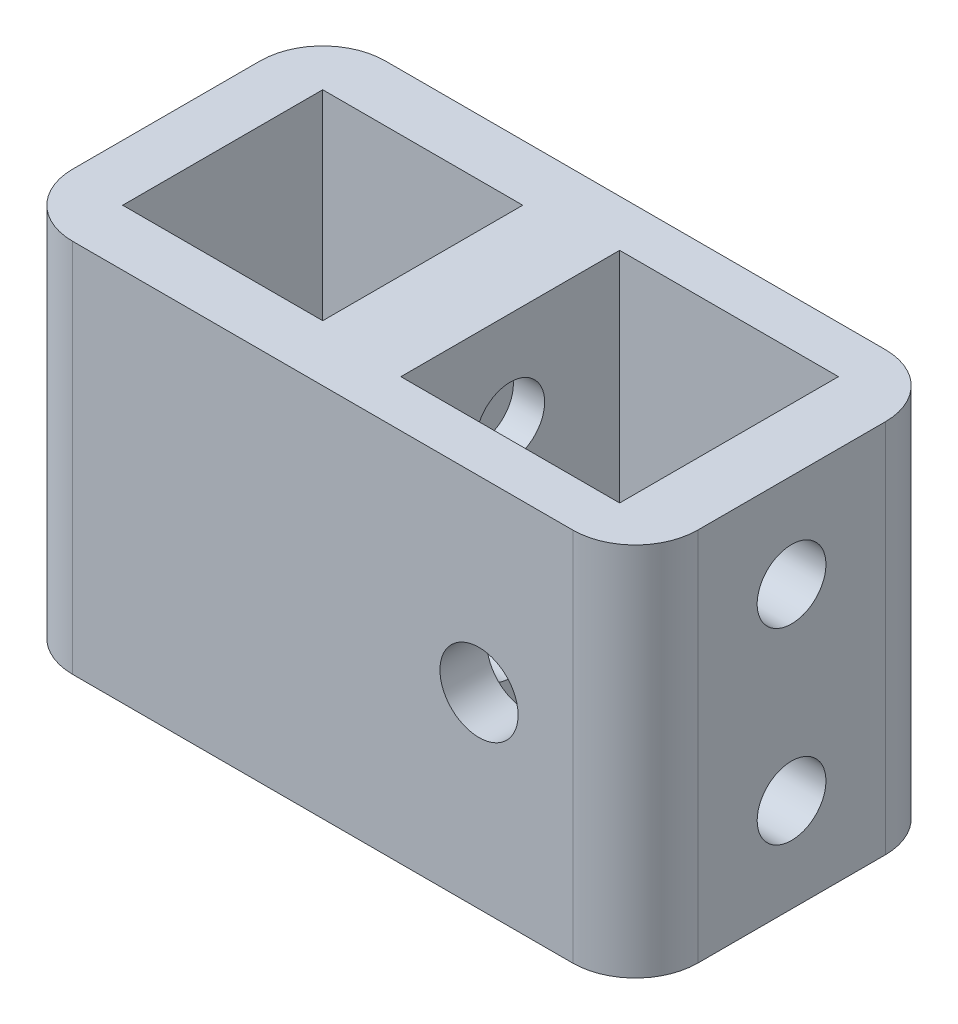
ISO-10303-21;
HEADER;
FILE_DESCRIPTION(('STEP AP214'),'2;1');
FILE_NAME('part.step','',(''),(''),'','','');
FILE_SCHEMA(('AUTOMOTIVE_DESIGN { 1 0 10303 214 1 1 1 1 }'));
ENDSEC;
DATA;
#1=APPLICATION_CONTEXT('core data for automotive mechanical design processes');
#2=APPLICATION_PROTOCOL_DEFINITION('international standard','automotive_design',2000,#1);
#3=PRODUCT_CONTEXT('',#1,'mechanical');
#4=PRODUCT('Part','Part','',(#3));
#5=PRODUCT_RELATED_PRODUCT_CATEGORY('part','',(#4));
#6=PRODUCT_DEFINITION_FORMATION('','',#4);
#7=PRODUCT_DEFINITION_CONTEXT('part definition',#1,'design');
#8=PRODUCT_DEFINITION('design','',#6,#7);
#9=PRODUCT_DEFINITION_SHAPE('','',#8);
#10=(LENGTH_UNIT() NAMED_UNIT(*) SI_UNIT(.MILLI.,.METRE.));
#11=(NAMED_UNIT(*) PLANE_ANGLE_UNIT() SI_UNIT($,.RADIAN.));
#12=(NAMED_UNIT(*) SI_UNIT($,.STERADIAN.) SOLID_ANGLE_UNIT());
#13=UNCERTAINTY_MEASURE_WITH_UNIT(LENGTH_MEASURE(1.E-05),#10,'distance_accuracy_value','');
#14=(GEOMETRIC_REPRESENTATION_CONTEXT(3) GLOBAL_UNCERTAINTY_ASSIGNED_CONTEXT((#13)) GLOBAL_UNIT_ASSIGNED_CONTEXT((#10,
#11,#12)) REPRESENTATION_CONTEXT('',''));
#15=CARTESIAN_POINT('',(0.,0.,0.));
#16=DIRECTION('',(0.,0.,1.));
#17=DIRECTION('',(1.,0.,0.));
#18=AXIS2_PLACEMENT_3D('',#15,#16,#17);
#19=CARTESIAN_POINT('',(10.,6.,-7.));
#20=DIRECTION('',(0.,0.,1.));
#21=DIRECTION('',(1.,0.,0.));
#22=AXIS2_PLACEMENT_3D('',#19,#20,#21);
#23=CYLINDRICAL_SURFACE('',#22,1.25);
#24=CARTESIAN_POINT('',(10.,6.,-5.));
#25=DIRECTION('',(0.,0.,1.));
#26=DIRECTION('',(1.,0.,0.));
#27=AXIS2_PLACEMENT_3D('',#24,#25,#26);
#28=CIRCLE('',#27,1.25);
#29=CARTESIAN_POINT('',(11.25,6.,-5.));
#30=VERTEX_POINT('',#29);
#31=EDGE_CURVE('E210',#30,#30,#28,.T.);
#32=ORIENTED_EDGE('',*,*,#31,.F.);
#33=EDGE_LOOP('',(#32));
#34=FACE_BOUND('',#33,.T.);
#35=CARTESIAN_POINT('',(10.,6.,-3.5));
#36=DIRECTION('',(0.,0.,1.));
#37=DIRECTION('',(1.,0.,0.));
#38=AXIS2_PLACEMENT_3D('',#35,#36,#37);
#39=CIRCLE('',#38,1.25);
#40=CARTESIAN_POINT('',(11.25,6.,-3.5));
#41=VERTEX_POINT('',#40);
#42=EDGE_CURVE('E190',#41,#41,#39,.F.);
#43=ORIENTED_EDGE('',*,*,#42,.F.);
#44=EDGE_LOOP('',(#43));
#45=FACE_BOUND('',#44,.T.);
#46=ADVANCED_FACE('F36',(#34,#45),#23,.F.);
#47=CARTESIAN_POINT('',(0.,4.,0.));
#48=DIRECTION('',(0.,1.,0.));
#49=DIRECTION('',(0.,0.,1.));
#50=AXIS2_PLACEMENT_3D('',#47,#48,#49);
#51=PLANE('',#50);
#52=CARTESIAN_POINT('',(0.,4.,0.));
#53=DIRECTION('',(0.,1.,0.));
#54=DIRECTION('',(0.,0.,1.));
#55=AXIS2_PLACEMENT_3D('',#52,#53,#54);
#56=CIRCLE('',#55,2.);
#57=CARTESIAN_POINT('',(0.,4.,2.));
#58=VERTEX_POINT('',#57);
#59=EDGE_CURVE('E260',#58,#58,#56,.T.);
#60=ORIENTED_EDGE('',*,*,#59,.F.);
#61=EDGE_LOOP('',(#60));
#62=FACE_BOUND('',#61,.T.);
#63=DIRECTION('',(0.,0.,1.));
#64=VECTOR('',#63,1.);
#65=CARTESIAN_POINT('',(-3.2,4.,0.));
#66=LINE('',#65,#64);
#67=CARTESIAN_POINT('',(-3.2,4.,-3.2));
#68=VERTEX_POINT('',#67);
#69=CARTESIAN_POINT('',(-3.2,4.,3.2));
#70=VERTEX_POINT('',#69);
#71=EDGE_CURVE('E255',#68,#70,#66,.T.);
#72=ORIENTED_EDGE('',*,*,#71,.T.);
#73=DIRECTION('',(1.,0.,0.));
#74=VECTOR('',#73,1.);
#75=CARTESIAN_POINT('',(0.,4.,3.2));
#76=LINE('',#75,#74);
#77=CARTESIAN_POINT('',(3.2,4.,3.2));
#78=VERTEX_POINT('',#77);
#79=EDGE_CURVE('E257',#70,#78,#76,.T.);
#80=ORIENTED_EDGE('',*,*,#79,.T.);
#81=DIRECTION('',(0.,0.,1.));
#82=VECTOR('',#81,1.);
#83=CARTESIAN_POINT('',(3.2,4.,0.));
#84=LINE('',#83,#82);
#85=CARTESIAN_POINT('',(3.2,4.,-3.2));
#86=VERTEX_POINT('',#85);
#87=EDGE_CURVE('E249',#86,#78,#84,.T.);
#88=ORIENTED_EDGE('',*,*,#87,.F.);
#89=DIRECTION('',(1.,0.,0.));
#90=VECTOR('',#89,1.);
#91=CARTESIAN_POINT('',(0.,4.,-3.2));
#92=LINE('',#91,#90);
#93=EDGE_CURVE('E252',#68,#86,#92,.T.);
#94=ORIENTED_EDGE('',*,*,#93,.F.);
#95=EDGE_LOOP('',(#72,#80,#88,#94));
#96=FACE_BOUND('',#95,.T.);
#97=ADVANCED_FACE('F317',(#62,#96),#51,.T.);
#98=CARTESIAN_POINT('',(-5.,4.,0.));
#99=DIRECTION('',(-1.,0.,0.));
#100=DIRECTION('',(0.,0.,1.));
#101=AXIS2_PLACEMENT_3D('',#98,#99,#100);
#102=PLANE('',#101);
#103=DIRECTION('',(0.,0.,-1.));
#104=VECTOR('',#103,1.);
#105=CARTESIAN_POINT('',(-5.,0.,0.));
#106=LINE('',#105,#104);
#107=CARTESIAN_POINT('',(-5.,0.,3.));
#108=VERTEX_POINT('',#107);
#109=CARTESIAN_POINT('',(-5.,0.,-3.));
#110=VERTEX_POINT('',#109);
#111=EDGE_CURVE('E267',#108,#110,#106,.T.);
#112=ORIENTED_EDGE('',*,*,#111,.F.);
#113=DIRECTION('',(0.,-1.,0.));
#114=VECTOR('',#113,1.);
#115=CARTESIAN_POINT('',(-5.,4.,3.));
#116=LINE('',#115,#114);
#117=CARTESIAN_POINT('',(-5.,12.,3.));
#118=VERTEX_POINT('',#117);
#119=EDGE_CURVE('E292',#108,#118,#116,.F.);
#120=ORIENTED_EDGE('',*,*,#119,.T.);
#121=DIRECTION('',(0.,0.,-1.));
#122=VECTOR('',#121,1.);
#123=CARTESIAN_POINT('',(-5.,12.,0.));
#124=LINE('',#123,#122);
#125=CARTESIAN_POINT('',(-5.,12.,-3.));
#126=VERTEX_POINT('',#125);
#127=EDGE_CURVE('E214',#118,#126,#124,.T.);
#128=ORIENTED_EDGE('',*,*,#127,.T.);
#129=DIRECTION('',(0.,-1.,0.));
#130=VECTOR('',#129,1.);
#131=CARTESIAN_POINT('',(-5.,0.,-3.));
#132=LINE('',#131,#130);
#133=EDGE_CURVE('E289',#126,#110,#132,.T.);
#134=ORIENTED_EDGE('',*,*,#133,.T.);
#135=EDGE_LOOP('',(#112,#120,#128,#134));
#136=FACE_BOUND('',#135,.T.);
#137=ADVANCED_FACE('F324',(#136),#102,.T.);
#138=CARTESIAN_POINT('',(0.,4.,5.));
#139=DIRECTION('',(0.,0.,1.));
#140=DIRECTION('',(1.,0.,0.));
#141=AXIS2_PLACEMENT_3D('',#138,#139,#140);
#142=PLANE('',#141);
#143=CARTESIAN_POINT('',(10.,6.,5.));
#144=DIRECTION('',(0.,0.,1.));
#145=DIRECTION('',(1.,0.,0.));
#146=AXIS2_PLACEMENT_3D('',#143,#144,#145);
#147=CIRCLE('',#146,1.25);
#148=CARTESIAN_POINT('',(11.25,6.,5.));
#149=VERTEX_POINT('',#148);
#150=EDGE_CURVE('E199',#149,#149,#147,.T.);
#151=ORIENTED_EDGE('',*,*,#150,.F.);
#152=EDGE_LOOP('',(#151));
#153=FACE_BOUND('',#152,.T.);
#154=DIRECTION('',(-1.,0.,0.));
#155=VECTOR('',#154,1.);
#156=CARTESIAN_POINT('',(0.,12.,5.));
#157=LINE('',#156,#155);
#158=CARTESIAN_POINT('',(13.,12.,5.));
#159=VERTEX_POINT('',#158);
#160=CARTESIAN_POINT('',(-3.,12.,5.));
#161=VERTEX_POINT('',#160);
#162=EDGE_CURVE('E220',#159,#161,#157,.T.);
#163=ORIENTED_EDGE('',*,*,#162,.T.);
#164=DIRECTION('',(0.,-1.,0.));
#165=VECTOR('',#164,1.);
#166=CARTESIAN_POINT('',(-3.,4.,5.));
#167=LINE('',#166,#165);
#168=CARTESIAN_POINT('',(-3.,0.,5.));
#169=VERTEX_POINT('',#168);
#170=EDGE_CURVE('E278',#161,#169,#167,.T.);
#171=ORIENTED_EDGE('',*,*,#170,.T.);
#172=DIRECTION('',(-1.,0.,0.));
#173=VECTOR('',#172,1.);
#174=CARTESIAN_POINT('',(0.,0.,5.));
#175=LINE('',#174,#173);
#176=CARTESIAN_POINT('',(13.,0.,5.));
#177=VERTEX_POINT('',#176);
#178=EDGE_CURVE('E270',#177,#169,#175,.T.);
#179=ORIENTED_EDGE('',*,*,#178,.F.);
#180=DIRECTION('',(0.,-1.,0.));
#181=VECTOR('',#180,1.);
#182=CARTESIAN_POINT('',(13.,4.,5.));
#183=LINE('',#182,#181);
#184=EDGE_CURVE('E263',#177,#159,#183,.F.);
#185=ORIENTED_EDGE('',*,*,#184,.T.);
#186=EDGE_LOOP('',(#163,#171,#179,#185));
#187=FACE_BOUND('',#186,.T.);
#188=ADVANCED_FACE('F347',(#153,#187),#142,.T.);
#189=CARTESIAN_POINT('',(0.,4.,0.));
#190=DIRECTION('',(0.,-1.,0.));
#191=DIRECTION('',(0.,0.,-1.));
#192=AXIS2_PLACEMENT_3D('',#189,#190,#191);
#193=CYLINDRICAL_SURFACE('',#192,2.);
#194=ORIENTED_EDGE('',*,*,#59,.T.);
#195=EDGE_LOOP('',(#194));
#196=FACE_BOUND('',#195,.T.);
#197=CARTESIAN_POINT('',(0.,0.,0.));
#198=DIRECTION('',(0.,1.,0.));
#199=DIRECTION('',(0.,0.,1.));
#200=AXIS2_PLACEMENT_3D('',#197,#198,#199);
#201=CIRCLE('',#200,2.);
#202=CARTESIAN_POINT('',(0.,0.,2.));
#203=VERTEX_POINT('',#202);
#204=EDGE_CURVE('E259',#203,#203,#201,.T.);
#205=ORIENTED_EDGE('',*,*,#204,.F.);
#206=EDGE_LOOP('',(#205));
#207=FACE_BOUND('',#206,.T.);
#208=ADVANCED_FACE('F350',(#196,#207),#193,.F.);
#209=CARTESIAN_POINT('',(0.,4.,-5.));
#210=DIRECTION('',(0.,0.,1.));
#211=DIRECTION('',(1.,0.,0.));
#212=AXIS2_PLACEMENT_3D('',#209,#210,#211);
#213=PLANE('',#212);
#214=ORIENTED_EDGE('',*,*,#31,.T.);
#215=EDGE_LOOP('',(#214));
#216=FACE_BOUND('',#215,.T.);
#217=DIRECTION('',(-1.,0.,0.));
#218=VECTOR('',#217,1.);
#219=CARTESIAN_POINT('',(0.,0.,-5.));
#220=LINE('',#219,#218);
#221=CARTESIAN_POINT('',(13.,0.,-5.));
#222=VERTEX_POINT('',#221);
#223=CARTESIAN_POINT('',(-3.,0.,-5.));
#224=VERTEX_POINT('',#223);
#225=EDGE_CURVE('E264',#222,#224,#220,.T.);
#226=ORIENTED_EDGE('',*,*,#225,.T.);
#227=DIRECTION('',(0.,-1.,0.));
#228=VECTOR('',#227,1.);
#229=CARTESIAN_POINT('',(-3.,12.,-5.));
#230=LINE('',#229,#228);
#231=CARTESIAN_POINT('',(-3.,12.,-5.));
#232=VERTEX_POINT('',#231);
#233=EDGE_CURVE('E305',#224,#232,#230,.F.);
#234=ORIENTED_EDGE('',*,*,#233,.T.);
#235=DIRECTION('',(-1.,0.,0.));
#236=VECTOR('',#235,1.);
#237=CARTESIAN_POINT('',(0.,12.,-5.));
#238=LINE('',#237,#236);
#239=CARTESIAN_POINT('',(13.,12.,-5.));
#240=VERTEX_POINT('',#239);
#241=EDGE_CURVE('E223',#240,#232,#238,.T.);
#242=ORIENTED_EDGE('',*,*,#241,.F.);
#243=DIRECTION('',(0.,-1.,0.));
#244=VECTOR('',#243,1.);
#245=CARTESIAN_POINT('',(13.,0.,-5.));
#246=LINE('',#245,#244);
#247=EDGE_CURVE('E302',#240,#222,#246,.T.);
#248=ORIENTED_EDGE('',*,*,#247,.T.);
#249=EDGE_LOOP('',(#226,#234,#242,#248));
#250=FACE_BOUND('',#249,.T.);
#251=ADVANCED_FACE('F374',(#216,#250),#213,.F.);
#252=CARTESIAN_POINT('',(0.,0.,0.));
#253=DIRECTION('',(0.,1.,0.));
#254=DIRECTION('',(0.,0.,1.));
#255=AXIS2_PLACEMENT_3D('',#252,#253,#254);
#256=PLANE('',#255);
#257=DIRECTION('',(0.,0.,-1.));
#258=VECTOR('',#257,1.);
#259=CARTESIAN_POINT('',(6.,0.,0.));
#260=LINE('',#259,#258);
#261=CARTESIAN_POINT('',(6.,0.,3.5));
#262=VERTEX_POINT('',#261);
#263=CARTESIAN_POINT('',(6.,0.,-3.5));
#264=VERTEX_POINT('',#263);
#265=EDGE_CURVE('E188',#262,#264,#260,.T.);
#266=ORIENTED_EDGE('',*,*,#265,.F.);
#267=DIRECTION('',(1.,0.,0.));
#268=VECTOR('',#267,1.);
#269=CARTESIAN_POINT('',(0.,0.,3.5));
#270=LINE('',#269,#268);
#271=CARTESIAN_POINT('',(13.,0.,3.5));
#272=VERTEX_POINT('',#271);
#273=EDGE_CURVE('E192',#262,#272,#270,.T.);
#274=ORIENTED_EDGE('',*,*,#273,.T.);
#275=DIRECTION('',(0.,0.,-1.));
#276=VECTOR('',#275,1.);
#277=CARTESIAN_POINT('',(13.,0.,0.));
#278=LINE('',#277,#276);
#279=CARTESIAN_POINT('',(13.,0.,-3.5));
#280=VERTEX_POINT('',#279);
#281=EDGE_CURVE('E182',#272,#280,#278,.T.);
#282=ORIENTED_EDGE('',*,*,#281,.T.);
#283=DIRECTION('',(1.,0.,0.));
#284=VECTOR('',#283,1.);
#285=CARTESIAN_POINT('',(0.,0.,-3.5));
#286=LINE('',#285,#284);
#287=EDGE_CURVE('E156',#264,#280,#286,.T.);
#288=ORIENTED_EDGE('',*,*,#287,.F.);
#289=EDGE_LOOP('',(#266,#274,#282,#288));
#290=FACE_BOUND('',#289,.T.);
#291=ORIENTED_EDGE('',*,*,#178,.T.);
#292=CARTESIAN_POINT('',(-3.,0.,3.));
#293=DIRECTION('',(0.,1.,0.));
#294=DIRECTION('',(0.,0.,1.));
#295=AXIS2_PLACEMENT_3D('',#292,#293,#294);
#296=CIRCLE('',#295,2.);
#297=EDGE_CURVE('E287',#169,#108,#296,.F.);
#298=ORIENTED_EDGE('',*,*,#297,.T.);
#299=ORIENTED_EDGE('',*,*,#111,.T.);
#300=CARTESIAN_POINT('',(-3.,0.,-3.));
#301=DIRECTION('',(0.,1.,0.));
#302=DIRECTION('',(0.,0.,1.));
#303=AXIS2_PLACEMENT_3D('',#300,#301,#302);
#304=CIRCLE('',#303,2.);
#305=EDGE_CURVE('E285',#110,#224,#304,.F.);
#306=ORIENTED_EDGE('',*,*,#305,.T.);
#307=ORIENTED_EDGE('',*,*,#225,.F.);
#308=CARTESIAN_POINT('',(13.,0.,-3.));
#309=DIRECTION('',(0.,1.,0.));
#310=DIRECTION('',(0.,0.,1.));
#311=AXIS2_PLACEMENT_3D('',#308,#309,#310);
#312=CIRCLE('',#311,2.);
#313=CARTESIAN_POINT('',(15.,0.,-3.));
#314=VERTEX_POINT('',#313);
#315=EDGE_CURVE('E283',#222,#314,#312,.F.);
#316=ORIENTED_EDGE('',*,*,#315,.T.);
#317=DIRECTION('',(0.,0.,1.));
#318=VECTOR('',#317,1.);
#319=CARTESIAN_POINT('',(15.,0.,0.));
#320=LINE('',#319,#318);
#321=CARTESIAN_POINT('',(15.,0.,3.));
#322=VERTEX_POINT('',#321);
#323=EDGE_CURVE('E215',#314,#322,#320,.T.);
#324=ORIENTED_EDGE('',*,*,#323,.T.);
#325=CARTESIAN_POINT('',(13.,0.,3.));
#326=DIRECTION('',(0.,1.,0.));
#327=DIRECTION('',(0.,0.,1.));
#328=AXIS2_PLACEMENT_3D('',#325,#326,#327);
#329=CIRCLE('',#328,2.);
#330=EDGE_CURVE('E281',#322,#177,#329,.F.);
#331=ORIENTED_EDGE('',*,*,#330,.T.);
#332=EDGE_LOOP('',(#291,#298,#299,#306,#307,#316,#324,#331));
#333=FACE_BOUND('',#332,.T.);
#334=ORIENTED_EDGE('',*,*,#204,.T.);
#335=EDGE_LOOP('',(#334));
#336=FACE_BOUND('',#335,.T.);
#337=ADVANCED_FACE('F363',(#290,#333,#336),#256,.F.);
#338=CARTESIAN_POINT('',(0.,12.,3.2));
#339=DIRECTION('',(0.,0.,1.));
#340=DIRECTION('',(1.,0.,0.));
#341=AXIS2_PLACEMENT_3D('',#338,#339,#340);
#342=PLANE('',#341);
#343=ORIENTED_EDGE('',*,*,#79,.F.);
#344=DIRECTION('',(0.,-1.,0.));
#345=VECTOR('',#344,1.);
#346=CARTESIAN_POINT('',(-3.2,12.,3.2));
#347=LINE('',#346,#345);
#348=CARTESIAN_POINT('',(-3.2,12.,3.2));
#349=VERTEX_POINT('',#348);
#350=EDGE_CURVE('E246',#349,#70,#347,.T.);
#351=ORIENTED_EDGE('',*,*,#350,.F.);
#352=DIRECTION('',(-1.,0.,0.));
#353=VECTOR('',#352,1.);
#354=CARTESIAN_POINT('',(0.,12.,3.2));
#355=LINE('',#354,#353);
#356=CARTESIAN_POINT('',(3.2,12.,3.2));
#357=VERTEX_POINT('',#356);
#358=EDGE_CURVE('E226',#357,#349,#355,.T.);
#359=ORIENTED_EDGE('',*,*,#358,.F.);
#360=DIRECTION('',(0.,-1.,0.));
#361=VECTOR('',#360,1.);
#362=CARTESIAN_POINT('',(3.2,12.,3.2));
#363=LINE('',#362,#361);
#364=EDGE_CURVE('E237',#357,#78,#363,.T.);
#365=ORIENTED_EDGE('',*,*,#364,.T.);
#366=EDGE_LOOP('',(#343,#351,#359,#365));
#367=FACE_BOUND('',#366,.T.);
#368=ADVANCED_FACE('F397',(#367),#342,.F.);
#369=CARTESIAN_POINT('',(-3.2,12.,0.));
#370=DIRECTION('',(-1.,0.,0.));
#371=DIRECTION('',(0.,0.,1.));
#372=AXIS2_PLACEMENT_3D('',#369,#370,#371);
#373=PLANE('',#372);
#374=ORIENTED_EDGE('',*,*,#71,.F.);
#375=DIRECTION('',(0.,-1.,0.));
#376=VECTOR('',#375,1.);
#377=CARTESIAN_POINT('',(-3.2,12.,-3.2));
#378=LINE('',#377,#376);
#379=CARTESIAN_POINT('',(-3.2,12.,-3.2));
#380=VERTEX_POINT('',#379);
#381=EDGE_CURVE('E243',#380,#68,#378,.T.);
#382=ORIENTED_EDGE('',*,*,#381,.F.);
#383=DIRECTION('',(0.,0.,-1.));
#384=VECTOR('',#383,1.);
#385=CARTESIAN_POINT('',(-3.2,12.,0.));
#386=LINE('',#385,#384);
#387=EDGE_CURVE('E229',#349,#380,#386,.T.);
#388=ORIENTED_EDGE('',*,*,#387,.F.);
#389=ORIENTED_EDGE('',*,*,#350,.T.);
#390=EDGE_LOOP('',(#374,#382,#388,#389));
#391=FACE_BOUND('',#390,.T.);
#392=ADVANCED_FACE('F400',(#391),#373,.F.);
#393=CARTESIAN_POINT('',(0.,12.,-3.2));
#394=DIRECTION('',(0.,0.,1.));
#395=DIRECTION('',(1.,0.,0.));
#396=AXIS2_PLACEMENT_3D('',#393,#394,#395);
#397=PLANE('',#396);
#398=ORIENTED_EDGE('',*,*,#381,.T.);
#399=ORIENTED_EDGE('',*,*,#93,.T.);
#400=DIRECTION('',(0.,-1.,0.));
#401=VECTOR('',#400,1.);
#402=CARTESIAN_POINT('',(3.2,12.,-3.2));
#403=LINE('',#402,#401);
#404=CARTESIAN_POINT('',(3.2,12.,-3.2));
#405=VERTEX_POINT('',#404);
#406=EDGE_CURVE('E240',#405,#86,#403,.T.);
#407=ORIENTED_EDGE('',*,*,#406,.F.);
#408=DIRECTION('',(-1.,0.,0.));
#409=VECTOR('',#408,1.);
#410=CARTESIAN_POINT('',(0.,12.,-3.2));
#411=LINE('',#410,#409);
#412=EDGE_CURVE('E231',#405,#380,#411,.T.);
#413=ORIENTED_EDGE('',*,*,#412,.T.);
#414=EDGE_LOOP('',(#398,#399,#407,#413));
#415=FACE_BOUND('',#414,.T.);
#416=ADVANCED_FACE('F402',(#415),#397,.T.);
#417=CARTESIAN_POINT('',(3.2,12.,0.));
#418=DIRECTION('',(-1.,0.,0.));
#419=DIRECTION('',(0.,0.,1.));
#420=AXIS2_PLACEMENT_3D('',#417,#418,#419);
#421=PLANE('',#420);
#422=ORIENTED_EDGE('',*,*,#406,.T.);
#423=ORIENTED_EDGE('',*,*,#87,.T.);
#424=ORIENTED_EDGE('',*,*,#364,.F.);
#425=DIRECTION('',(0.,0.,-1.));
#426=VECTOR('',#425,1.);
#427=CARTESIAN_POINT('',(3.2,12.,0.));
#428=LINE('',#427,#426);
#429=EDGE_CURVE('E234',#357,#405,#428,.T.);
#430=ORIENTED_EDGE('',*,*,#429,.T.);
#431=EDGE_LOOP('',(#422,#423,#424,#430));
#432=FACE_BOUND('',#431,.T.);
#433=ADVANCED_FACE('F388',(#432),#421,.T.);
#434=CARTESIAN_POINT('',(0.,12.,0.));
#435=DIRECTION('',(0.,1.,0.));
#436=DIRECTION('',(0.,0.,1.));
#437=AXIS2_PLACEMENT_3D('',#434,#435,#436);
#438=PLANE('',#437);
#439=DIRECTION('',(1.,0.,0.));
#440=VECTOR('',#439,1.);
#441=CARTESIAN_POINT('',(0.,12.,3.5));
#442=LINE('',#441,#440);
#443=CARTESIAN_POINT('',(6.,12.,3.5));
#444=VERTEX_POINT('',#443);
#445=CARTESIAN_POINT('',(13.,12.,3.5));
#446=VERTEX_POINT('',#445);
#447=EDGE_CURVE('E61',#444,#446,#442,.T.);
#448=ORIENTED_EDGE('',*,*,#447,.F.);
#449=DIRECTION('',(0.,0.,-1.));
#450=VECTOR('',#449,1.);
#451=CARTESIAN_POINT('',(6.,12.,0.));
#452=LINE('',#451,#450);
#453=CARTESIAN_POINT('',(6.,12.,-3.5));
#454=VERTEX_POINT('',#453);
#455=EDGE_CURVE('E169',#444,#454,#452,.T.);
#456=ORIENTED_EDGE('',*,*,#455,.T.);
#457=DIRECTION('',(1.,0.,0.));
#458=VECTOR('',#457,1.);
#459=CARTESIAN_POINT('',(0.,12.,-3.5));
#460=LINE('',#459,#458);
#461=CARTESIAN_POINT('',(13.,12.,-3.5));
#462=VERTEX_POINT('',#461);
#463=EDGE_CURVE('E153',#454,#462,#460,.T.);
#464=ORIENTED_EDGE('',*,*,#463,.T.);
#465=DIRECTION('',(0.,0.,-1.));
#466=VECTOR('',#465,1.);
#467=CARTESIAN_POINT('',(13.,12.,0.));
#468=LINE('',#467,#466);
#469=EDGE_CURVE('E162',#446,#462,#468,.T.);
#470=ORIENTED_EDGE('',*,*,#469,.F.);
#471=EDGE_LOOP('',(#448,#456,#464,#470));
#472=FACE_BOUND('',#471,.T.);
#473=ORIENTED_EDGE('',*,*,#127,.F.);
#474=CARTESIAN_POINT('',(-3.,12.,3.));
#475=DIRECTION('',(0.,1.,0.));
#476=DIRECTION('',(0.,0.,1.));
#477=AXIS2_PLACEMENT_3D('',#474,#475,#476);
#478=CIRCLE('',#477,2.);
#479=EDGE_CURVE('E300',#118,#161,#478,.T.);
#480=ORIENTED_EDGE('',*,*,#479,.T.);
#481=ORIENTED_EDGE('',*,*,#162,.F.);
#482=CARTESIAN_POINT('',(13.,12.,3.));
#483=DIRECTION('',(0.,1.,0.));
#484=DIRECTION('',(0.,0.,1.));
#485=AXIS2_PLACEMENT_3D('',#482,#483,#484);
#486=CIRCLE('',#485,2.);
#487=CARTESIAN_POINT('',(15.,12.,3.));
#488=VERTEX_POINT('',#487);
#489=EDGE_CURVE('E294',#159,#488,#486,.T.);
#490=ORIENTED_EDGE('',*,*,#489,.T.);
#491=DIRECTION('',(0.,0.,1.));
#492=VECTOR('',#491,1.);
#493=CARTESIAN_POINT('',(15.,12.,0.));
#494=LINE('',#493,#492);
#495=CARTESIAN_POINT('',(15.,12.,-3.));
#496=VERTEX_POINT('',#495);
#497=EDGE_CURVE('E211',#496,#488,#494,.T.);
#498=ORIENTED_EDGE('',*,*,#497,.F.);
#499=CARTESIAN_POINT('',(13.,12.,-3.));
#500=DIRECTION('',(0.,1.,0.));
#501=DIRECTION('',(0.,0.,1.));
#502=AXIS2_PLACEMENT_3D('',#499,#500,#501);
#503=CIRCLE('',#502,2.);
#504=EDGE_CURVE('E296',#496,#240,#503,.T.);
#505=ORIENTED_EDGE('',*,*,#504,.T.);
#506=ORIENTED_EDGE('',*,*,#241,.T.);
#507=CARTESIAN_POINT('',(-3.,12.,-3.));
#508=DIRECTION('',(0.,1.,0.));
#509=DIRECTION('',(0.,0.,1.));
#510=AXIS2_PLACEMENT_3D('',#507,#508,#509);
#511=CIRCLE('',#510,2.);
#512=EDGE_CURVE('E298',#232,#126,#511,.T.);
#513=ORIENTED_EDGE('',*,*,#512,.T.);
#514=EDGE_LOOP('',(#473,#480,#481,#490,#498,#505,#506,#513));
#515=FACE_BOUND('',#514,.T.);
#516=ORIENTED_EDGE('',*,*,#358,.T.);
#517=ORIENTED_EDGE('',*,*,#387,.T.);
#518=ORIENTED_EDGE('',*,*,#412,.F.);
#519=ORIENTED_EDGE('',*,*,#429,.F.);
#520=EDGE_LOOP('',(#516,#517,#518,#519));
#521=FACE_BOUND('',#520,.T.);
#522=ADVANCED_FACE('F166',(#472,#515,#521),#438,.T.);
#523=CARTESIAN_POINT('',(15.,12.,0.));
#524=DIRECTION('',(1.,0.,0.));
#525=DIRECTION('',(0.,0.,-1.));
#526=AXIS2_PLACEMENT_3D('',#523,#524,#525);
#527=PLANE('',#526);
#528=CARTESIAN_POINT('',(15.,9.00000000000001,0.));
#529=DIRECTION('',(1.,0.,0.));
#530=DIRECTION('',(0.,0.,-1.));
#531=AXIS2_PLACEMENT_3D('',#528,#529,#530);
#532=CIRCLE('',#531,1.1);
#533=CARTESIAN_POINT('',(15.,9.00000000000001,-1.1));
#534=VERTEX_POINT('',#533);
#535=EDGE_CURVE('E200',#534,#534,#532,.T.);
#536=ORIENTED_EDGE('',*,*,#535,.F.);
#537=EDGE_LOOP('',(#536));
#538=FACE_BOUND('',#537,.T.);
#539=CARTESIAN_POINT('',(15.,2.99999999999999,0.));
#540=DIRECTION('',(1.,0.,0.));
#541=DIRECTION('',(0.,0.,1.));
#542=AXIS2_PLACEMENT_3D('',#539,#540,#541);
#543=CIRCLE('',#542,1.1);
#544=CARTESIAN_POINT('',(15.,2.99999999999999,1.1));
#545=VERTEX_POINT('',#544);
#546=EDGE_CURVE('E195',#545,#545,#543,.T.);
#547=ORIENTED_EDGE('',*,*,#546,.F.);
#548=EDGE_LOOP('',(#547));
#549=FACE_BOUND('',#548,.T.);
#550=ORIENTED_EDGE('',*,*,#323,.F.);
#551=DIRECTION('',(0.,-1.,0.));
#552=VECTOR('',#551,1.);
#553=CARTESIAN_POINT('',(15.,12.,-3.));
#554=LINE('',#553,#552);
#555=EDGE_CURVE('E11',#314,#496,#554,.F.);
#556=ORIENTED_EDGE('',*,*,#555,.T.);
#557=ORIENTED_EDGE('',*,*,#497,.T.);
#558=DIRECTION('',(0.,-1.,0.));
#559=VECTOR('',#558,1.);
#560=CARTESIAN_POINT('',(15.,12.,3.));
#561=LINE('',#560,#559);
#562=EDGE_CURVE('E45',#488,#322,#561,.T.);
#563=ORIENTED_EDGE('',*,*,#562,.T.);
#564=EDGE_LOOP('',(#550,#556,#557,#563));
#565=FACE_BOUND('',#564,.T.);
#566=ADVANCED_FACE('F332',(#538,#549,#565),#527,.T.);
#567=CARTESIAN_POINT('',(10.,6.,3.5));
#568=DIRECTION('',(0.,0.,1.));
#569=DIRECTION('',(1.,0.,0.));
#570=AXIS2_PLACEMENT_3D('',#567,#568,#569);
#571=CIRCLE('',#570,1.25);
#572=CARTESIAN_POINT('',(11.25,6.,3.5));
#573=VERTEX_POINT('',#572);
#574=EDGE_CURVE('E40',#573,#573,#571,.F.);
#575=ORIENTED_EDGE('',*,*,#574,.T.);
#576=EDGE_LOOP('',(#575));
#577=FACE_BOUND('',#576,.T.);
#578=ORIENTED_EDGE('',*,*,#150,.T.);
#579=EDGE_LOOP('',(#578));
#580=FACE_BOUND('',#579,.T.);
#581=ADVANCED_FACE('F320',(#577,#580),#23,.F.);
#582=CARTESIAN_POINT('',(5.,2.99999999999999,0.));
#583=DIRECTION('',(1.,0.,0.));
#584=DIRECTION('',(0.,0.,-1.));
#585=AXIS2_PLACEMENT_3D('',#582,#583,#584);
#586=CYLINDRICAL_SURFACE('',#585,1.1);
#587=CARTESIAN_POINT('',(13.,2.99999999999999,0.));
#588=DIRECTION('',(1.,0.,0.));
#589=DIRECTION('',(0.,0.,-1.));
#590=AXIS2_PLACEMENT_3D('',#587,#588,#589);
#591=CIRCLE('',#590,1.1);
#592=CARTESIAN_POINT('',(13.,2.99999999999999,-1.1));
#593=VERTEX_POINT('',#592);
#594=EDGE_CURVE('E179',#593,#593,#591,.F.);
#595=ORIENTED_EDGE('',*,*,#594,.T.);
#596=EDGE_LOOP('',(#595));
#597=FACE_BOUND('',#596,.T.);
#598=ORIENTED_EDGE('',*,*,#546,.T.);
#599=EDGE_LOOP('',(#598));
#600=FACE_BOUND('',#599,.T.);
#601=ADVANCED_FACE('F331',(#597,#600),#586,.F.);
#602=CARTESIAN_POINT('',(5.,9.00000000000001,0.));
#603=DIRECTION('',(1.,0.,0.));
#604=DIRECTION('',(0.,0.,-1.));
#605=AXIS2_PLACEMENT_3D('',#602,#603,#604);
#606=CYLINDRICAL_SURFACE('',#605,1.1);
#607=CARTESIAN_POINT('',(13.,9.00000000000001,0.));
#608=DIRECTION('',(1.,0.,0.));
#609=DIRECTION('',(0.,0.,-1.));
#610=AXIS2_PLACEMENT_3D('',#607,#608,#609);
#611=CIRCLE('',#610,1.1);
#612=CARTESIAN_POINT('',(13.,9.00000000000001,-1.1));
#613=VERTEX_POINT('',#612);
#614=EDGE_CURVE('E176',#613,#613,#611,.F.);
#615=ORIENTED_EDGE('',*,*,#614,.T.);
#616=EDGE_LOOP('',(#615));
#617=FACE_BOUND('',#616,.T.);
#618=ORIENTED_EDGE('',*,*,#535,.T.);
#619=EDGE_LOOP('',(#618));
#620=FACE_BOUND('',#619,.T.);
#621=ADVANCED_FACE('F338',(#617,#620),#606,.F.);
#622=CARTESIAN_POINT('',(-3.,4.,3.));
#623=DIRECTION('',(0.,-1.,0.));
#624=DIRECTION('',(0.,0.,-1.));
#625=AXIS2_PLACEMENT_3D('',#622,#623,#624);
#626=CYLINDRICAL_SURFACE('',#625,2.);
#627=ORIENTED_EDGE('',*,*,#479,.F.);
#628=ORIENTED_EDGE('',*,*,#119,.F.);
#629=ORIENTED_EDGE('',*,*,#297,.F.);
#630=ORIENTED_EDGE('',*,*,#170,.F.);
#631=EDGE_LOOP('',(#627,#628,#629,#630));
#632=FACE_BOUND('',#631,.T.);
#633=ADVANCED_FACE('F359',(#632),#626,.T.);
#634=CARTESIAN_POINT('',(-3.,4.,-3.));
#635=DIRECTION('',(0.,1.,0.));
#636=DIRECTION('',(0.,0.,1.));
#637=AXIS2_PLACEMENT_3D('',#634,#635,#636);
#638=CYLINDRICAL_SURFACE('',#637,2.);
#639=ORIENTED_EDGE('',*,*,#512,.F.);
#640=ORIENTED_EDGE('',*,*,#233,.F.);
#641=ORIENTED_EDGE('',*,*,#305,.F.);
#642=ORIENTED_EDGE('',*,*,#133,.F.);
#643=EDGE_LOOP('',(#639,#640,#641,#642));
#644=FACE_BOUND('',#643,.T.);
#645=ADVANCED_FACE('F370',(#644),#638,.T.);
#646=CARTESIAN_POINT('',(13.,4.,-3.));
#647=DIRECTION('',(0.,1.,0.));
#648=DIRECTION('',(0.,0.,1.));
#649=AXIS2_PLACEMENT_3D('',#646,#647,#648);
#650=CYLINDRICAL_SURFACE('',#649,2.);
#651=ORIENTED_EDGE('',*,*,#504,.F.);
#652=ORIENTED_EDGE('',*,*,#555,.F.);
#653=ORIENTED_EDGE('',*,*,#315,.F.);
#654=ORIENTED_EDGE('',*,*,#247,.F.);
#655=EDGE_LOOP('',(#651,#652,#653,#654));
#656=FACE_BOUND('',#655,.T.);
#657=ADVANCED_FACE('F379',(#656),#650,.T.);
#658=CARTESIAN_POINT('',(13.,12.,3.));
#659=DIRECTION('',(0.,-1.,0.));
#660=DIRECTION('',(0.,0.,-1.));
#661=AXIS2_PLACEMENT_3D('',#658,#659,#660);
#662=CYLINDRICAL_SURFACE('',#661,2.);
#663=ORIENTED_EDGE('',*,*,#489,.F.);
#664=ORIENTED_EDGE('',*,*,#184,.F.);
#665=ORIENTED_EDGE('',*,*,#330,.F.);
#666=ORIENTED_EDGE('',*,*,#562,.F.);
#667=EDGE_LOOP('',(#663,#664,#665,#666));
#668=FACE_BOUND('',#667,.T.);
#669=ADVANCED_FACE('F38',(#668),#662,.T.);
#670=CARTESIAN_POINT('',(0.,-2.,3.5));
#671=DIRECTION('',(0.,0.,1.));
#672=DIRECTION('',(1.,0.,0.));
#673=AXIS2_PLACEMENT_3D('',#670,#671,#672);
#674=PLANE('',#673);
#675=ORIENTED_EDGE('',*,*,#574,.F.);
#676=EDGE_LOOP('',(#675));
#677=FACE_BOUND('',#676,.T.);
#678=DIRECTION('',(0.,1.,0.));
#679=VECTOR('',#678,1.);
#680=CARTESIAN_POINT('',(6.,-2.,3.5));
#681=LINE('',#680,#679);
#682=EDGE_CURVE('E174',#262,#444,#681,.T.);
#683=ORIENTED_EDGE('',*,*,#682,.T.);
#684=ORIENTED_EDGE('',*,*,#447,.T.);
#685=DIRECTION('',(0.,1.,0.));
#686=VECTOR('',#685,1.);
#687=CARTESIAN_POINT('',(13.,-2.,3.5));
#688=LINE('',#687,#686);
#689=EDGE_CURVE('E159',#272,#446,#688,.T.);
#690=ORIENTED_EDGE('',*,*,#689,.F.);
#691=ORIENTED_EDGE('',*,*,#273,.F.);
#692=EDGE_LOOP('',(#683,#684,#690,#691));
#693=FACE_BOUND('',#692,.T.);
#694=ADVANCED_FACE('F434',(#677,#693),#674,.F.);
#695=CARTESIAN_POINT('',(0.,-2.,-3.5));
#696=DIRECTION('',(0.,0.,1.));
#697=DIRECTION('',(1.,0.,0.));
#698=AXIS2_PLACEMENT_3D('',#695,#696,#697);
#699=PLANE('',#698);
#700=ORIENTED_EDGE('',*,*,#42,.T.);
#701=EDGE_LOOP('',(#700));
#702=FACE_BOUND('',#701,.T.);
#703=ORIENTED_EDGE('',*,*,#287,.T.);
#704=DIRECTION('',(0.,1.,0.));
#705=VECTOR('',#704,1.);
#706=CARTESIAN_POINT('',(13.,-2.,-3.5));
#707=LINE('',#706,#705);
#708=EDGE_CURVE('E53',#280,#462,#707,.T.);
#709=ORIENTED_EDGE('',*,*,#708,.T.);
#710=ORIENTED_EDGE('',*,*,#463,.F.);
#711=DIRECTION('',(0.,1.,0.));
#712=VECTOR('',#711,1.);
#713=CARTESIAN_POINT('',(6.,-2.,-3.5));
#714=LINE('',#713,#712);
#715=EDGE_CURVE('E158',#264,#454,#714,.T.);
#716=ORIENTED_EDGE('',*,*,#715,.F.);
#717=EDGE_LOOP('',(#703,#709,#710,#716));
#718=FACE_BOUND('',#717,.T.);
#719=ADVANCED_FACE('F150',(#702,#718),#699,.T.);
#720=CARTESIAN_POINT('',(6.,-2.,0.));
#721=DIRECTION('',(1.,0.,0.));
#722=DIRECTION('',(0.,0.,-1.));
#723=AXIS2_PLACEMENT_3D('',#720,#721,#722);
#724=PLANE('',#723);
#725=CARTESIAN_POINT('',(6.,2.99999999999999,0.));
#726=DIRECTION('',(1.,0.,0.));
#727=DIRECTION('',(0.,0.,-1.));
#728=AXIS2_PLACEMENT_3D('',#725,#726,#727);
#729=CIRCLE('',#728,1.1);
#730=CARTESIAN_POINT('',(6.,2.99999999999999,-1.1));
#731=VERTEX_POINT('',#730);
#732=EDGE_CURVE('E185',#731,#731,#729,.F.);
#733=ORIENTED_EDGE('',*,*,#732,.T.);
#734=EDGE_LOOP('',(#733));
#735=FACE_BOUND('',#734,.T.);
#736=CARTESIAN_POINT('',(6.,9.00000000000001,0.));
#737=DIRECTION('',(1.,0.,0.));
#738=DIRECTION('',(0.,0.,-1.));
#739=AXIS2_PLACEMENT_3D('',#736,#737,#738);
#740=CIRCLE('',#739,1.1);
#741=CARTESIAN_POINT('',(6.,9.00000000000001,-1.1));
#742=VERTEX_POINT('',#741);
#743=EDGE_CURVE('E184',#742,#742,#740,.F.);
#744=ORIENTED_EDGE('',*,*,#743,.T.);
#745=EDGE_LOOP('',(#744));
#746=FACE_BOUND('',#745,.T.);
#747=ORIENTED_EDGE('',*,*,#265,.T.);
#748=ORIENTED_EDGE('',*,*,#715,.T.);
#749=ORIENTED_EDGE('',*,*,#455,.F.);
#750=ORIENTED_EDGE('',*,*,#682,.F.);
#751=EDGE_LOOP('',(#747,#748,#749,#750));
#752=FACE_BOUND('',#751,.T.);
#753=ADVANCED_FACE('F443',(#735,#746,#752),#724,.T.);
#754=CARTESIAN_POINT('',(13.,-2.,0.));
#755=DIRECTION('',(1.,0.,0.));
#756=DIRECTION('',(0.,0.,-1.));
#757=AXIS2_PLACEMENT_3D('',#754,#755,#756);
#758=PLANE('',#757);
#759=ORIENTED_EDGE('',*,*,#614,.F.);
#760=EDGE_LOOP('',(#759));
#761=FACE_BOUND('',#760,.T.);
#762=ORIENTED_EDGE('',*,*,#594,.F.);
#763=EDGE_LOOP('',(#762));
#764=FACE_BOUND('',#763,.T.);
#765=ORIENTED_EDGE('',*,*,#689,.T.);
#766=ORIENTED_EDGE('',*,*,#469,.T.);
#767=ORIENTED_EDGE('',*,*,#708,.F.);
#768=ORIENTED_EDGE('',*,*,#281,.F.);
#769=EDGE_LOOP('',(#765,#766,#767,#768));
#770=FACE_BOUND('',#769,.T.);
#771=ADVANCED_FACE('F163',(#761,#764,#770),#758,.F.);
#772=CARTESIAN_POINT('',(5.,9.00000000000001,0.));
#773=DIRECTION('',(1.,0.,0.));
#774=DIRECTION('',(0.,0.,-1.));
#775=AXIS2_PLACEMENT_3D('',#772,#773,#774);
#776=PLANE('',#775);
#777=CARTESIAN_POINT('',(5.,9.00000000000001,0.));
#778=DIRECTION('',(1.,0.,0.));
#779=DIRECTION('',(0.,0.,-1.));
#780=AXIS2_PLACEMENT_3D('',#777,#778,#779);
#781=CIRCLE('',#780,1.1);
#782=CARTESIAN_POINT('',(5.,9.00000000000001,-1.1));
#783=VERTEX_POINT('',#782);
#784=EDGE_CURVE('E196',#783,#783,#781,.T.);
#785=ORIENTED_EDGE('',*,*,#784,.T.);
#786=EDGE_LOOP('',(#785));
#787=FACE_BOUND('',#786,.T.);
#788=ADVANCED_FACE('F447',(#787),#776,.T.);
#789=ORIENTED_EDGE('',*,*,#784,.F.);
#790=EDGE_LOOP('',(#789));
#791=FACE_BOUND('',#790,.T.);
#792=ORIENTED_EDGE('',*,*,#743,.F.);
#793=EDGE_LOOP('',(#792));
#794=FACE_BOUND('',#793,.T.);
#795=ADVANCED_FACE('F450',(#791,#794),#606,.F.);
#796=CARTESIAN_POINT('',(5.,2.99999999999999,0.));
#797=DIRECTION('',(-1.,0.,0.));
#798=DIRECTION('',(0.,0.,1.));
#799=AXIS2_PLACEMENT_3D('',#796,#797,#798);
#800=PLANE('',#799);
#801=CARTESIAN_POINT('',(5.,2.99999999999999,0.));
#802=DIRECTION('',(1.,0.,0.));
#803=DIRECTION('',(0.,0.,1.));
#804=AXIS2_PLACEMENT_3D('',#801,#802,#803);
#805=CIRCLE('',#804,1.1);
#806=CARTESIAN_POINT('',(5.,2.99999999999999,1.1));
#807=VERTEX_POINT('',#806);
#808=EDGE_CURVE('E203',#807,#807,#805,.T.);
#809=ORIENTED_EDGE('',*,*,#808,.T.);
#810=EDGE_LOOP('',(#809));
#811=FACE_BOUND('',#810,.T.);
#812=ADVANCED_FACE('F455',(#811),#800,.F.);
#813=ORIENTED_EDGE('',*,*,#808,.F.);
#814=EDGE_LOOP('',(#813));
#815=FACE_BOUND('',#814,.T.);
#816=ORIENTED_EDGE('',*,*,#732,.F.);
#817=EDGE_LOOP('',(#816));
#818=FACE_BOUND('',#817,.T.);
#819=ADVANCED_FACE('F340',(#815,#818),#586,.F.);
#820=CLOSED_SHELL('',(#46,#97,#137,#188,#208,#251,#337,#368,#392,#416,#433,#522,#566,#581,#601,
#621,#633,#645,#657,#669,#694,#719,#753,#771,#788,#795,#812,#819));
#821=MANIFOLD_SOLID_BREP('B2',#820);
#822=ADVANCED_BREP_SHAPE_REPRESENTATION('',(#18,#821),#14);
#823=SHAPE_DEFINITION_REPRESENTATION(#9,#822);
ENDSEC;
END-ISO-10303-21;
